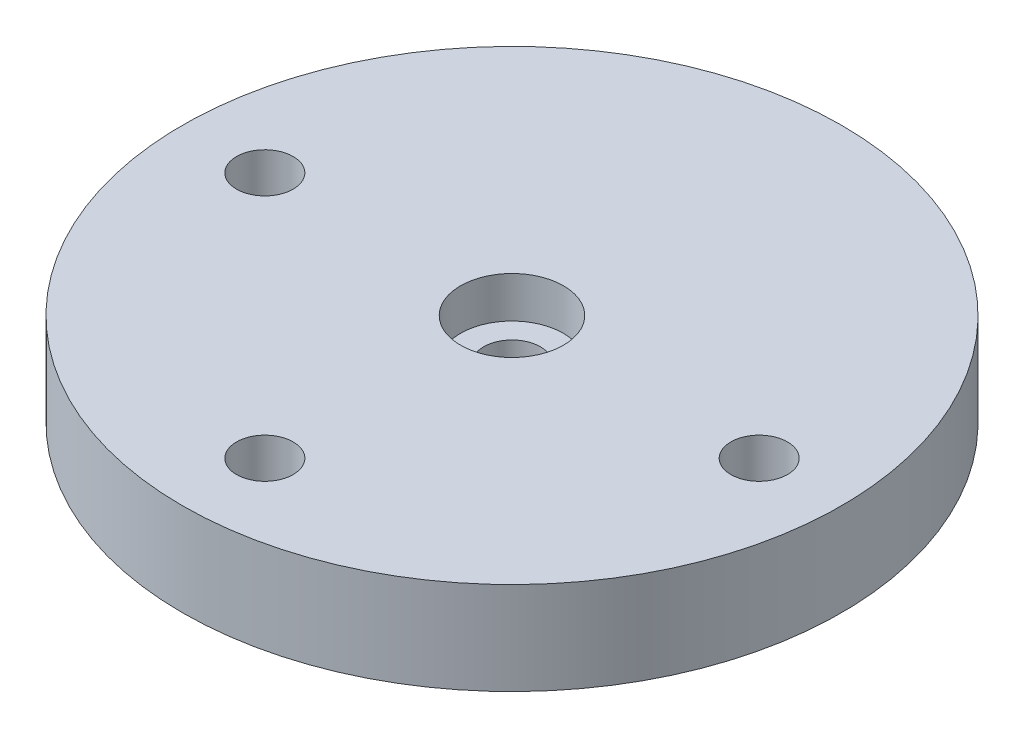
ISO-10303-21;
HEADER;
FILE_DESCRIPTION(('STEP AP214'),'2;1');
FILE_NAME('part.step','',(''),(''),'','','');
FILE_SCHEMA(('AUTOMOTIVE_DESIGN { 1 0 10303 214 1 1 1 1 }'));
ENDSEC;
DATA;
#1=APPLICATION_CONTEXT('core data for automotive mechanical design processes');
#2=APPLICATION_PROTOCOL_DEFINITION('international standard','automotive_design',2000,#1);
#3=PRODUCT_CONTEXT('',#1,'mechanical');
#4=PRODUCT('Part','Part','',(#3));
#5=PRODUCT_RELATED_PRODUCT_CATEGORY('part','',(#4));
#6=PRODUCT_DEFINITION_FORMATION('','',#4);
#7=PRODUCT_DEFINITION_CONTEXT('part definition',#1,'design');
#8=PRODUCT_DEFINITION('design','',#6,#7);
#9=PRODUCT_DEFINITION_SHAPE('','',#8);
#10=(LENGTH_UNIT() NAMED_UNIT(*) SI_UNIT(.MILLI.,.METRE.));
#11=(NAMED_UNIT(*) PLANE_ANGLE_UNIT() SI_UNIT($,.RADIAN.));
#12=(NAMED_UNIT(*) SI_UNIT($,.STERADIAN.) SOLID_ANGLE_UNIT());
#13=UNCERTAINTY_MEASURE_WITH_UNIT(LENGTH_MEASURE(1.E-05),#10,'distance_accuracy_value','');
#14=(GEOMETRIC_REPRESENTATION_CONTEXT(3) GLOBAL_UNCERTAINTY_ASSIGNED_CONTEXT((#13)) GLOBAL_UNIT_ASSIGNED_CONTEXT((#10,
#11,#12)) REPRESENTATION_CONTEXT('',''));
#15=CARTESIAN_POINT('',(0.,0.,0.));
#16=DIRECTION('',(0.,0.,1.));
#17=DIRECTION('',(1.,0.,0.));
#18=AXIS2_PLACEMENT_3D('',#15,#16,#17);
#19=CARTESIAN_POINT('',(-197.116314394239,-548.017679595946,-866.486147986318));
#20=DIRECTION('',(0.,1.,0.));
#21=DIRECTION('',(-1.,0.,0.));
#22=AXIS2_PLACEMENT_3D('',#19,#20,#21);
#23=PLANE('',#22);
#24=CARTESIAN_POINT('',(-197.12,-548.017679595946,-866.489999999998));
#25=DIRECTION('',(0.,-1.,0.));
#26=DIRECTION('',(0.,0.,-1.));
#27=AXIS2_PLACEMENT_3D('',#24,#25,#26);
#28=CIRCLE('',#27,2.75);
#29=CARTESIAN_POINT('',(-197.12,-548.017679595946,-869.239999999998));
#30=VERTEX_POINT('',#29);
#31=EDGE_CURVE('E20',#30,#30,#28,.F.);
#32=ORIENTED_EDGE('',*,*,#31,.T.);
#33=EDGE_LOOP('',(#32));
#34=FACE_BOUND('',#33,.T.);
#35=DIRECTION('',(-1.,0.,0.));
#36=VECTOR('',#35,1.);
#37=CARTESIAN_POINT('',(-197.116314394238,-548.017679595946,-856.486147986318));
#38=LINE('',#37,#36);
#39=CARTESIAN_POINT('',(-208.572753631627,-548.017679595946,-856.486147986318));
#40=VERTEX_POINT('',#39);
#41=CARTESIAN_POINT('',(-185.659875156849,-548.017679595946,-856.486147986318));
#42=VERTEX_POINT('',#41);
#43=EDGE_CURVE('E107',#40,#42,#38,.F.);
#44=ORIENTED_EDGE('',*,*,#43,.F.);
#45=CARTESIAN_POINT('',(-208.572753631628,-548.017679595946,-861.486147986318));
#46=DIRECTION('',(0.,1.,0.));
#47=DIRECTION('',(-1.,0.,0.));
#48=AXIS2_PLACEMENT_3D('',#45,#46,#47);
#49=CIRCLE('',#48,4.99999999999999);
#50=CARTESIAN_POINT('',(-213.155329326584,-548.017679595946,-859.486147986318));
#51=VERTEX_POINT('',#50);
#52=EDGE_CURVE('E160',#40,#51,#49,.F.);
#53=ORIENTED_EDGE('',*,*,#52,.T.);
#54=CARTESIAN_POINT('',(-197.116314394238,-548.017679595946,-866.486147986318));
#55=DIRECTION('',(0.,-1.,0.));
#56=DIRECTION('',(1.,0.,0.));
#57=AXIS2_PLACEMENT_3D('',#54,#55,#56);
#58=CIRCLE('',#57,17.5);
#59=CARTESIAN_POINT('',(-213.155329326583,-548.017679595946,-873.486147986319));
#60=VERTEX_POINT('',#59);
#61=EDGE_CURVE('E164',#51,#60,#58,.T.);
#62=ORIENTED_EDGE('',*,*,#61,.T.);
#63=CARTESIAN_POINT('',(-208.572753631628,-548.017679595946,-871.486147986319));
#64=DIRECTION('',(0.,-1.,0.));
#65=DIRECTION('',(1.,0.,0.));
#66=AXIS2_PLACEMENT_3D('',#63,#64,#65);
#67=CIRCLE('',#66,4.99999999999999);
#68=CARTESIAN_POINT('',(-208.572753631627,-548.017679595946,-876.486147986319));
#69=VERTEX_POINT('',#68);
#70=EDGE_CURVE('E110',#60,#69,#67,.T.);
#71=ORIENTED_EDGE('',*,*,#70,.T.);
#72=DIRECTION('',(1.,0.,0.));
#73=VECTOR('',#72,1.);
#74=CARTESIAN_POINT('',(-197.116314394238,-548.017679595946,-876.486147986319));
#75=LINE('',#74,#73);
#76=CARTESIAN_POINT('',(-185.659875156849,-548.017679595946,-876.486147986319));
#77=VERTEX_POINT('',#76);
#78=EDGE_CURVE('E86',#77,#69,#75,.F.);
#79=ORIENTED_EDGE('',*,*,#78,.F.);
#80=CARTESIAN_POINT('',(-185.659875156849,-548.017679595946,-871.486147986319));
#81=DIRECTION('',(0.,1.,0.));
#82=DIRECTION('',(-1.,0.,0.));
#83=AXIS2_PLACEMENT_3D('',#80,#81,#82);
#84=CIRCLE('',#83,4.99999999999999);
#85=CARTESIAN_POINT('',(-181.077299461893,-548.017679595946,-873.486147986319));
#86=VERTEX_POINT('',#85);
#87=EDGE_CURVE('E79',#77,#86,#84,.F.);
#88=ORIENTED_EDGE('',*,*,#87,.T.);
#89=CARTESIAN_POINT('',(-197.116314394238,-548.017679595946,-866.486147986318));
#90=DIRECTION('',(0.,-1.,0.));
#91=DIRECTION('',(1.,0.,0.));
#92=AXIS2_PLACEMENT_3D('',#89,#90,#91);
#93=CIRCLE('',#92,17.5);
#94=CARTESIAN_POINT('',(-181.077299461893,-548.017679595946,-859.486147986318));
#95=VERTEX_POINT('',#94);
#96=EDGE_CURVE('E83',#86,#95,#93,.T.);
#97=ORIENTED_EDGE('',*,*,#96,.T.);
#98=CARTESIAN_POINT('',(-185.659875156849,-548.017679595946,-861.486147986318));
#99=DIRECTION('',(0.,-1.,0.));
#100=DIRECTION('',(1.,0.,0.));
#101=AXIS2_PLACEMENT_3D('',#98,#99,#100);
#102=CIRCLE('',#101,4.99999999999999);
#103=EDGE_CURVE('E158',#95,#42,#102,.T.);
#104=ORIENTED_EDGE('',*,*,#103,.T.);
#105=EDGE_LOOP('',(#44,#53,#62,#71,#79,#88,#97,#104));
#106=FACE_BOUND('',#105,.T.);
#107=ADVANCED_FACE('F17',(#34,#106),#23,.F.);
#108=CARTESIAN_POINT('',(-197.12,-541.517668980284,-866.489999999998));
#109=DIRECTION('',(0.,-1.,0.));
#110=DIRECTION('',(0.,0.,-1.));
#111=AXIS2_PLACEMENT_3D('',#108,#109,#110);
#112=CYLINDRICAL_SURFACE('',#111,2.75);
#113=CARTESIAN_POINT('',(-197.12,-545.517668980283,-866.489999999998));
#114=DIRECTION('',(0.,-1.,0.));
#115=DIRECTION('',(0.,0.,-1.));
#116=AXIS2_PLACEMENT_3D('',#113,#114,#115);
#117=CIRCLE('',#116,2.75);
#118=CARTESIAN_POINT('',(-197.12,-545.517668980283,-869.239999999998));
#119=VERTEX_POINT('',#118);
#120=EDGE_CURVE('E155',#119,#119,#117,.F.);
#121=ORIENTED_EDGE('',*,*,#120,.T.);
#122=EDGE_LOOP('',(#121));
#123=FACE_BOUND('',#122,.T.);
#124=ORIENTED_EDGE('',*,*,#31,.F.);
#125=EDGE_LOOP('',(#124));
#126=FACE_BOUND('',#125,.T.);
#127=ADVANCED_FACE('F350',(#123,#126),#112,.F.);
#128=CARTESIAN_POINT('',(-197.116314394238,-559.517679595946,-866.486147986318));
#129=DIRECTION('',(0.,-1.,0.));
#130=DIRECTION('',(1.,0.,0.));
#131=AXIS2_PLACEMENT_3D('',#128,#129,#130);
#132=CYLINDRICAL_SURFACE('',#131,17.5);
#133=DIRECTION('',(0.,-1.,0.));
#134=VECTOR('',#133,1.);
#135=CARTESIAN_POINT('',(-181.077299461893,-559.517679595946,-859.486147986318));
#136=LINE('',#135,#134);
#137=CARTESIAN_POINT('',(-181.077299461893,-550.517668980283,-859.486147986318));
#138=VERTEX_POINT('',#137);
#139=EDGE_CURVE('E96',#138,#95,#136,.F.);
#140=ORIENTED_EDGE('',*,*,#139,.T.);
#141=ORIENTED_EDGE('',*,*,#96,.F.);
#142=DIRECTION('',(0.,1.,0.));
#143=VECTOR('',#142,1.);
#144=CARTESIAN_POINT('',(-181.077299461893,-559.517679595946,-873.486147986318));
#145=LINE('',#144,#143);
#146=CARTESIAN_POINT('',(-181.077299461893,-550.517668980283,-873.486147986319));
#147=VERTEX_POINT('',#146);
#148=EDGE_CURVE('E90',#86,#147,#145,.F.);
#149=ORIENTED_EDGE('',*,*,#148,.T.);
#150=CARTESIAN_POINT('',(-197.116314394238,-550.517668980283,-866.486147986318));
#151=DIRECTION('',(0.,-1.,0.));
#152=DIRECTION('',(1.,0.,0.));
#153=AXIS2_PLACEMENT_3D('',#150,#151,#152);
#154=CIRCLE('',#153,17.5);
#155=EDGE_CURVE('E153',#138,#147,#154,.F.);
#156=ORIENTED_EDGE('',*,*,#155,.F.);
#157=EDGE_LOOP('',(#140,#141,#149,#156));
#158=FACE_BOUND('',#157,.T.);
#159=ADVANCED_FACE('F93',(#158),#132,.F.);
#160=CARTESIAN_POINT('',(-185.659875156849,-559.517679595946,-871.486147986319));
#161=DIRECTION('',(0.,1.,0.));
#162=DIRECTION('',(-1.,0.,0.));
#163=AXIS2_PLACEMENT_3D('',#160,#161,#162);
#164=CYLINDRICAL_SURFACE('',#163,4.99999999999999);
#165=ORIENTED_EDGE('',*,*,#148,.F.);
#166=ORIENTED_EDGE('',*,*,#87,.F.);
#167=DIRECTION('',(0.,1.,0.));
#168=VECTOR('',#167,1.);
#169=CARTESIAN_POINT('',(-185.659875156849,-544.517679595948,-876.486147986319));
#170=LINE('',#169,#168);
#171=CARTESIAN_POINT('',(-185.659875156849,-550.517668980283,-876.486147986319));
#172=VERTEX_POINT('',#171);
#173=EDGE_CURVE('E102',#172,#77,#170,.T.);
#174=ORIENTED_EDGE('',*,*,#173,.F.);
#175=CARTESIAN_POINT('',(-185.659875156849,-550.517668980283,-871.486147986319));
#176=DIRECTION('',(0.,1.,0.));
#177=DIRECTION('',(-1.,0.,0.));
#178=AXIS2_PLACEMENT_3D('',#175,#176,#177);
#179=CIRCLE('',#178,4.99999999999999);
#180=EDGE_CURVE('E100',#147,#172,#179,.T.);
#181=ORIENTED_EDGE('',*,*,#180,.F.);
#182=EDGE_LOOP('',(#165,#166,#174,#181));
#183=FACE_BOUND('',#182,.T.);
#184=ADVANCED_FACE('F98',(#183),#164,.F.);
#185=CARTESIAN_POINT('',(-197.116314394238,-544.517679595948,-876.486147986319));
#186=DIRECTION('',(0.,0.,1.));
#187=DIRECTION('',(1.,0.,0.));
#188=AXIS2_PLACEMENT_3D('',#185,#186,#187);
#189=PLANE('',#188);
#190=DIRECTION('',(0.,-1.,0.));
#191=VECTOR('',#190,1.);
#192=CARTESIAN_POINT('',(-208.572753631626,-559.517679595946,-876.486147986319));
#193=LINE('',#192,#191);
#194=CARTESIAN_POINT('',(-208.572753631627,-550.517668980283,-876.486147986319));
#195=VERTEX_POINT('',#194);
#196=EDGE_CURVE('E167',#69,#195,#193,.T.);
#197=ORIENTED_EDGE('',*,*,#196,.T.);
#198=DIRECTION('',(1.,0.,0.));
#199=VECTOR('',#198,1.);
#200=CARTESIAN_POINT('',(-197.12,-550.517668980283,-876.486147986319));
#201=LINE('',#200,#199);
#202=EDGE_CURVE('E151',#172,#195,#201,.F.);
#203=ORIENTED_EDGE('',*,*,#202,.F.);
#204=ORIENTED_EDGE('',*,*,#173,.T.);
#205=ORIENTED_EDGE('',*,*,#78,.T.);
#206=EDGE_LOOP('',(#197,#203,#204,#205));
#207=FACE_BOUND('',#206,.T.);
#208=ADVANCED_FACE('F327',(#207),#189,.T.);
#209=CARTESIAN_POINT('',(-208.572753631628,-559.517679595946,-871.486147986319));
#210=DIRECTION('',(0.,-1.,0.));
#211=DIRECTION('',(1.,0.,0.));
#212=AXIS2_PLACEMENT_3D('',#209,#210,#211);
#213=CYLINDRICAL_SURFACE('',#212,4.99999999999999);
#214=ORIENTED_EDGE('',*,*,#196,.F.);
#215=ORIENTED_EDGE('',*,*,#70,.F.);
#216=DIRECTION('',(0.,-1.,0.));
#217=VECTOR('',#216,1.);
#218=CARTESIAN_POINT('',(-213.155329326583,-559.517679595946,-873.486147986319));
#219=LINE('',#218,#217);
#220=CARTESIAN_POINT('',(-213.155329326583,-550.517668980283,-873.486147986319));
#221=VERTEX_POINT('',#220);
#222=EDGE_CURVE('E166',#60,#221,#219,.T.);
#223=ORIENTED_EDGE('',*,*,#222,.T.);
#224=CARTESIAN_POINT('',(-208.572753631628,-550.517668980283,-871.486147986319));
#225=DIRECTION('',(0.,-1.,0.));
#226=DIRECTION('',(1.,0.,0.));
#227=AXIS2_PLACEMENT_3D('',#224,#225,#226);
#228=CIRCLE('',#227,4.99999999999999);
#229=EDGE_CURVE('E148',#195,#221,#228,.F.);
#230=ORIENTED_EDGE('',*,*,#229,.F.);
#231=EDGE_LOOP('',(#214,#215,#223,#230));
#232=FACE_BOUND('',#231,.T.);
#233=ADVANCED_FACE('F318',(#232),#213,.F.);
#234=CARTESIAN_POINT('',(-197.116314394238,-559.517679595946,-866.486147986318));
#235=DIRECTION('',(0.,-1.,0.));
#236=DIRECTION('',(1.,0.,0.));
#237=AXIS2_PLACEMENT_3D('',#234,#235,#236);
#238=CYLINDRICAL_SURFACE('',#237,17.5);
#239=ORIENTED_EDGE('',*,*,#222,.F.);
#240=ORIENTED_EDGE('',*,*,#61,.F.);
#241=DIRECTION('',(0.,1.,0.));
#242=VECTOR('',#241,1.);
#243=CARTESIAN_POINT('',(-213.155329326584,-559.517679595946,-859.486147986318));
#244=LINE('',#243,#242);
#245=CARTESIAN_POINT('',(-213.155329326584,-550.517668980283,-859.486147986318));
#246=VERTEX_POINT('',#245);
#247=EDGE_CURVE('E163',#51,#246,#244,.F.);
#248=ORIENTED_EDGE('',*,*,#247,.T.);
#249=CARTESIAN_POINT('',(-197.116314394238,-550.517668980283,-866.486147986318));
#250=DIRECTION('',(0.,-1.,0.));
#251=DIRECTION('',(1.,0.,0.));
#252=AXIS2_PLACEMENT_3D('',#249,#250,#251);
#253=CIRCLE('',#252,17.5);
#254=EDGE_CURVE('E145',#221,#246,#253,.F.);
#255=ORIENTED_EDGE('',*,*,#254,.F.);
#256=EDGE_LOOP('',(#239,#240,#248,#255));
#257=FACE_BOUND('',#256,.T.);
#258=ADVANCED_FACE('F310',(#257),#238,.F.);
#259=CARTESIAN_POINT('',(-208.572753631628,-559.517679595946,-861.486147986318));
#260=DIRECTION('',(0.,1.,0.));
#261=DIRECTION('',(-1.,0.,0.));
#262=AXIS2_PLACEMENT_3D('',#259,#260,#261);
#263=CYLINDRICAL_SURFACE('',#262,4.99999999999999);
#264=DIRECTION('',(0.,1.,0.));
#265=VECTOR('',#264,1.);
#266=CARTESIAN_POINT('',(-208.572753631626,-544.517679595948,-856.486147986318));
#267=LINE('',#266,#265);
#268=CARTESIAN_POINT('',(-208.572753631627,-550.517668980283,-856.486147986318));
#269=VERTEX_POINT('',#268);
#270=EDGE_CURVE('E109',#269,#40,#267,.T.);
#271=ORIENTED_EDGE('',*,*,#270,.F.);
#272=CARTESIAN_POINT('',(-208.572753631628,-550.517668980283,-861.486147986318));
#273=DIRECTION('',(0.,1.,0.));
#274=DIRECTION('',(-1.,0.,0.));
#275=AXIS2_PLACEMENT_3D('',#272,#273,#274);
#276=CIRCLE('',#275,4.99999999999999);
#277=EDGE_CURVE('E142',#246,#269,#276,.T.);
#278=ORIENTED_EDGE('',*,*,#277,.F.);
#279=ORIENTED_EDGE('',*,*,#247,.F.);
#280=ORIENTED_EDGE('',*,*,#52,.F.);
#281=EDGE_LOOP('',(#271,#278,#279,#280));
#282=FACE_BOUND('',#281,.T.);
#283=ADVANCED_FACE('F189',(#282),#263,.F.);
#284=CARTESIAN_POINT('',(-197.116314394238,-544.517679595948,-856.486147986318));
#285=DIRECTION('',(0.,0.,-1.));
#286=DIRECTION('',(-1.,0.,0.));
#287=AXIS2_PLACEMENT_3D('',#284,#285,#286);
#288=PLANE('',#287);
#289=ORIENTED_EDGE('',*,*,#270,.T.);
#290=ORIENTED_EDGE('',*,*,#43,.T.);
#291=DIRECTION('',(0.,-1.,0.));
#292=VECTOR('',#291,1.);
#293=CARTESIAN_POINT('',(-185.659875156849,-559.517679595946,-856.486147986318));
#294=LINE('',#293,#292);
#295=CARTESIAN_POINT('',(-185.659875156849,-550.517668980283,-856.486147986318));
#296=VERTEX_POINT('',#295);
#297=EDGE_CURVE('E35',#42,#296,#294,.T.);
#298=ORIENTED_EDGE('',*,*,#297,.T.);
#299=DIRECTION('',(1.,0.,0.));
#300=VECTOR('',#299,1.);
#301=CARTESIAN_POINT('',(-197.12,-550.517668980283,-856.486147986318));
#302=LINE('',#301,#300);
#303=EDGE_CURVE('E141',#269,#296,#302,.T.);
#304=ORIENTED_EDGE('',*,*,#303,.F.);
#305=EDGE_LOOP('',(#289,#290,#298,#304));
#306=FACE_BOUND('',#305,.T.);
#307=ADVANCED_FACE('F187',(#306),#288,.T.);
#308=CARTESIAN_POINT('',(-185.659875156849,-559.517679595946,-861.486147986318));
#309=DIRECTION('',(0.,-1.,0.));
#310=DIRECTION('',(1.,0.,0.));
#311=AXIS2_PLACEMENT_3D('',#308,#309,#310);
#312=CYLINDRICAL_SURFACE('',#311,4.99999999999999);
#313=ORIENTED_EDGE('',*,*,#139,.F.);
#314=CARTESIAN_POINT('',(-185.659875156849,-550.517668980283,-861.486147986318));
#315=DIRECTION('',(0.,-1.,0.));
#316=DIRECTION('',(1.,0.,0.));
#317=AXIS2_PLACEMENT_3D('',#314,#315,#316);
#318=CIRCLE('',#317,4.99999999999999);
#319=EDGE_CURVE('E138',#296,#138,#318,.F.);
#320=ORIENTED_EDGE('',*,*,#319,.F.);
#321=ORIENTED_EDGE('',*,*,#297,.F.);
#322=ORIENTED_EDGE('',*,*,#103,.F.);
#323=EDGE_LOOP('',(#313,#320,#321,#322));
#324=FACE_BOUND('',#323,.T.);
#325=ADVANCED_FACE('F192',(#324),#312,.F.);
#326=CARTESIAN_POINT('',(-197.12,-545.517668980283,-866.489999999998));
#327=DIRECTION('',(0.,-1.,0.));
#328=DIRECTION('',(0.,0.,-1.));
#329=AXIS2_PLACEMENT_3D('',#326,#327,#328);
#330=PLANE('',#329);
#331=ORIENTED_EDGE('',*,*,#120,.F.);
#332=EDGE_LOOP('',(#331));
#333=FACE_BOUND('',#332,.T.);
#334=CARTESIAN_POINT('',(-197.12,-545.517668980283,-866.489999999998));
#335=DIRECTION('',(0.,-1.,0.));
#336=DIRECTION('',(0.,0.,-1.));
#337=AXIS2_PLACEMENT_3D('',#334,#335,#336);
#338=CIRCLE('',#337,4.99999999999999);
#339=CARTESIAN_POINT('',(-197.12,-545.517668980283,-871.489999999998));
#340=VERTEX_POINT('',#339);
#341=EDGE_CURVE('E132',#340,#340,#338,.F.);
#342=ORIENTED_EDGE('',*,*,#341,.T.);
#343=EDGE_LOOP('',(#342));
#344=FACE_BOUND('',#343,.T.);
#345=ADVANCED_FACE('F194',(#333,#344),#330,.F.);
#346=CARTESIAN_POINT('',(-197.12,-550.517668980283,-866.490000000001));
#347=DIRECTION('',(0.,-1.,0.));
#348=DIRECTION('',(0.,0.,-1.));
#349=AXIS2_PLACEMENT_3D('',#346,#347,#348);
#350=PLANE('',#349);
#351=CARTESIAN_POINT('',(-197.116421040885,-550.517668980283,-842.486132571243));
#352=DIRECTION('',(0.,-1.,0.));
#353=DIRECTION('',(0.,0.,-1.));
#354=AXIS2_PLACEMENT_3D('',#351,#352,#353);
#355=CIRCLE('',#354,2.75);
#356=CARTESIAN_POINT('',(-197.116421040885,-550.517668980283,-845.236132571243));
#357=VERTEX_POINT('',#356);
#358=EDGE_CURVE('E123',#357,#357,#355,.F.);
#359=ORIENTED_EDGE('',*,*,#358,.T.);
#360=EDGE_LOOP('',(#359));
#361=FACE_BOUND('',#360,.T.);
#362=CARTESIAN_POINT('',(-221.116320245502,-550.517668980283,-866.486147986318));
#363=DIRECTION('',(0.,-1.,0.));
#364=DIRECTION('',(0.,0.,-1.));
#365=AXIS2_PLACEMENT_3D('',#362,#363,#364);
#366=CIRCLE('',#365,2.75);
#367=CARTESIAN_POINT('',(-221.116320245502,-550.517668980283,-869.236147986318));
#368=VERTEX_POINT('',#367);
#369=EDGE_CURVE('E126',#368,#368,#366,.F.);
#370=ORIENTED_EDGE('',*,*,#369,.T.);
#371=EDGE_LOOP('',(#370));
#372=FACE_BOUND('',#371,.T.);
#373=CARTESIAN_POINT('',(-173.116320245502,-550.517668980283,-866.486147986318));
#374=DIRECTION('',(0.,-1.,0.));
#375=DIRECTION('',(0.,0.,-1.));
#376=AXIS2_PLACEMENT_3D('',#373,#374,#375);
#377=CIRCLE('',#376,2.75);
#378=CARTESIAN_POINT('',(-173.116320245502,-550.517668980283,-869.236147986318));
#379=VERTEX_POINT('',#378);
#380=EDGE_CURVE('E129',#379,#379,#377,.F.);
#381=ORIENTED_EDGE('',*,*,#380,.T.);
#382=EDGE_LOOP('',(#381));
#383=FACE_BOUND('',#382,.T.);
#384=ORIENTED_EDGE('',*,*,#303,.T.);
#385=ORIENTED_EDGE('',*,*,#319,.T.);
#386=ORIENTED_EDGE('',*,*,#155,.T.);
#387=ORIENTED_EDGE('',*,*,#180,.T.);
#388=ORIENTED_EDGE('',*,*,#202,.T.);
#389=ORIENTED_EDGE('',*,*,#229,.T.);
#390=ORIENTED_EDGE('',*,*,#254,.T.);
#391=ORIENTED_EDGE('',*,*,#277,.T.);
#392=EDGE_LOOP('',(#384,#385,#386,#387,#388,#389,#390,#391));
#393=FACE_BOUND('',#392,.T.);
#394=CARTESIAN_POINT('',(-197.12,-550.517668980283,-866.490000000001));
#395=DIRECTION('',(0.,-1.,0.));
#396=DIRECTION('',(0.,0.,-1.));
#397=AXIS2_PLACEMENT_3D('',#394,#395,#396);
#398=CIRCLE('',#397,32.);
#399=CARTESIAN_POINT('',(-197.12,-550.517668980283,-898.490000000001));
#400=VERTEX_POINT('',#399);
#401=EDGE_CURVE('E135',#400,#400,#398,.F.);
#402=ORIENTED_EDGE('',*,*,#401,.F.);
#403=EDGE_LOOP('',(#402));
#404=FACE_BOUND('',#403,.T.);
#405=ADVANCED_FACE('F184',(#361,#372,#383,#393,#404),#350,.T.);
#406=CARTESIAN_POINT('',(-197.12,-546.517668980284,-866.490000000001));
#407=DIRECTION('',(0.,-1.,0.));
#408=DIRECTION('',(0.,0.,-1.));
#409=AXIS2_PLACEMENT_3D('',#406,#407,#408);
#410=CYLINDRICAL_SURFACE('',#409,32.);
#411=ORIENTED_EDGE('',*,*,#401,.T.);
#412=EDGE_LOOP('',(#411));
#413=FACE_BOUND('',#412,.T.);
#414=CARTESIAN_POINT('',(-197.12,-541.517668980284,-866.490000000001));
#415=DIRECTION('',(0.,-1.,0.));
#416=DIRECTION('',(0.,0.,-1.));
#417=AXIS2_PLACEMENT_3D('',#414,#415,#416);
#418=CIRCLE('',#417,32.);
#419=CARTESIAN_POINT('',(-197.12,-541.517668980284,-898.490000000001));
#420=VERTEX_POINT('',#419);
#421=EDGE_CURVE('E120',#420,#420,#418,.F.);
#422=ORIENTED_EDGE('',*,*,#421,.F.);
#423=EDGE_LOOP('',(#422));
#424=FACE_BOUND('',#423,.T.);
#425=ADVANCED_FACE('F227',(#413,#424),#410,.T.);
#426=CARTESIAN_POINT('',(-197.12,-543.517668980283,-866.489999999998));
#427=DIRECTION('',(0.,-1.,0.));
#428=DIRECTION('',(0.,0.,-1.));
#429=AXIS2_PLACEMENT_3D('',#426,#427,#428);
#430=CYLINDRICAL_SURFACE('',#429,4.99999999999999);
#431=CARTESIAN_POINT('',(-197.12,-541.517668980284,-866.489999999998));
#432=DIRECTION('',(0.,-1.,0.));
#433=DIRECTION('',(0.,0.,-1.));
#434=AXIS2_PLACEMENT_3D('',#431,#432,#433);
#435=CIRCLE('',#434,4.99999999999999);
#436=CARTESIAN_POINT('',(-197.12,-541.517668980284,-871.489999999998));
#437=VERTEX_POINT('',#436);
#438=EDGE_CURVE('E117',#437,#437,#435,.T.);
#439=ORIENTED_EDGE('',*,*,#438,.F.);
#440=EDGE_LOOP('',(#439));
#441=FACE_BOUND('',#440,.T.);
#442=ORIENTED_EDGE('',*,*,#341,.F.);
#443=EDGE_LOOP('',(#442));
#444=FACE_BOUND('',#443,.T.);
#445=ADVANCED_FACE('F223',(#441,#444),#430,.F.);
#446=CARTESIAN_POINT('',(-173.116320245502,-541.517668980284,-866.486147986318));
#447=DIRECTION('',(0.,-1.,0.));
#448=DIRECTION('',(0.,0.,-1.));
#449=AXIS2_PLACEMENT_3D('',#446,#447,#448);
#450=CYLINDRICAL_SURFACE('',#449,2.75);
#451=CARTESIAN_POINT('',(-173.116320245502,-541.517668980284,-866.486147986318));
#452=DIRECTION('',(0.,-1.,0.));
#453=DIRECTION('',(0.,0.,-1.));
#454=AXIS2_PLACEMENT_3D('',#451,#452,#453);
#455=CIRCLE('',#454,2.75);
#456=CARTESIAN_POINT('',(-173.116320245502,-541.517668980284,-869.236147986318));
#457=VERTEX_POINT('',#456);
#458=EDGE_CURVE('E114',#457,#457,#455,.T.);
#459=ORIENTED_EDGE('',*,*,#458,.F.);
#460=EDGE_LOOP('',(#459));
#461=FACE_BOUND('',#460,.T.);
#462=ORIENTED_EDGE('',*,*,#380,.F.);
#463=EDGE_LOOP('',(#462));
#464=FACE_BOUND('',#463,.T.);
#465=ADVANCED_FACE('F219',(#461,#464),#450,.F.);
#466=CARTESIAN_POINT('',(-221.116320245502,-541.517668980284,-866.486147986318));
#467=DIRECTION('',(0.,-1.,0.));
#468=DIRECTION('',(0.,0.,-1.));
#469=AXIS2_PLACEMENT_3D('',#466,#467,#468);
#470=CYLINDRICAL_SURFACE('',#469,2.75);
#471=CARTESIAN_POINT('',(-221.116320245502,-541.517668980284,-866.486147986318));
#472=DIRECTION('',(0.,-1.,0.));
#473=DIRECTION('',(0.,0.,-1.));
#474=AXIS2_PLACEMENT_3D('',#471,#472,#473);
#475=CIRCLE('',#474,2.75);
#476=CARTESIAN_POINT('',(-221.116320245502,-541.517668980284,-869.236147986318));
#477=VERTEX_POINT('',#476);
#478=EDGE_CURVE('E26',#477,#477,#475,.T.);
#479=ORIENTED_EDGE('',*,*,#478,.F.);
#480=EDGE_LOOP('',(#479));
#481=FACE_BOUND('',#480,.T.);
#482=ORIENTED_EDGE('',*,*,#369,.F.);
#483=EDGE_LOOP('',(#482));
#484=FACE_BOUND('',#483,.T.);
#485=ADVANCED_FACE('F212',(#481,#484),#470,.F.);
#486=CARTESIAN_POINT('',(-197.116421040885,-541.517668980284,-842.486132571243));
#487=DIRECTION('',(0.,-1.,0.));
#488=DIRECTION('',(0.,0.,-1.));
#489=AXIS2_PLACEMENT_3D('',#486,#487,#488);
#490=CYLINDRICAL_SURFACE('',#489,2.75);
#491=CARTESIAN_POINT('',(-197.116421040885,-541.517668980284,-842.486132571243));
#492=DIRECTION('',(0.,-1.,0.));
#493=DIRECTION('',(0.,0.,-1.));
#494=AXIS2_PLACEMENT_3D('',#491,#492,#493);
#495=CIRCLE('',#494,2.75);
#496=CARTESIAN_POINT('',(-197.116421040885,-541.517668980284,-845.236132571243));
#497=VERTEX_POINT('',#496);
#498=EDGE_CURVE('E11',#497,#497,#495,.T.);
#499=ORIENTED_EDGE('',*,*,#498,.F.);
#500=EDGE_LOOP('',(#499));
#501=FACE_BOUND('',#500,.T.);
#502=ORIENTED_EDGE('',*,*,#358,.F.);
#503=EDGE_LOOP('',(#502));
#504=FACE_BOUND('',#503,.T.);
#505=ADVANCED_FACE('F206',(#501,#504),#490,.F.);
#506=CARTESIAN_POINT('',(-197.12,-541.517668980284,-866.490000000001));
#507=DIRECTION('',(0.,1.,0.));
#508=DIRECTION('',(0.,0.,1.));
#509=AXIS2_PLACEMENT_3D('',#506,#507,#508);
#510=PLANE('',#509);
#511=ORIENTED_EDGE('',*,*,#498,.T.);
#512=EDGE_LOOP('',(#511));
#513=FACE_BOUND('',#512,.T.);
#514=ORIENTED_EDGE('',*,*,#478,.T.);
#515=EDGE_LOOP('',(#514));
#516=FACE_BOUND('',#515,.T.);
#517=ORIENTED_EDGE('',*,*,#458,.T.);
#518=EDGE_LOOP('',(#517));
#519=FACE_BOUND('',#518,.T.);
#520=ORIENTED_EDGE('',*,*,#438,.T.);
#521=EDGE_LOOP('',(#520));
#522=FACE_BOUND('',#521,.T.);
#523=ORIENTED_EDGE('',*,*,#421,.T.);
#524=EDGE_LOOP('',(#523));
#525=FACE_BOUND('',#524,.T.);
#526=ADVANCED_FACE('F204',(#513,#516,#519,#522,#525),#510,.T.);
#527=CLOSED_SHELL('',(#107,#127,#159,#184,#208,#233,#258,#283,#307,#325,#345,#405,#425,#445,
#465,#485,#505,#526));
#528=MANIFOLD_SOLID_BREP('B1',#527);
#529=ADVANCED_BREP_SHAPE_REPRESENTATION('',(#18,#528),#14);
#530=SHAPE_DEFINITION_REPRESENTATION(#9,#529);
ENDSEC;
END-ISO-10303-21;
